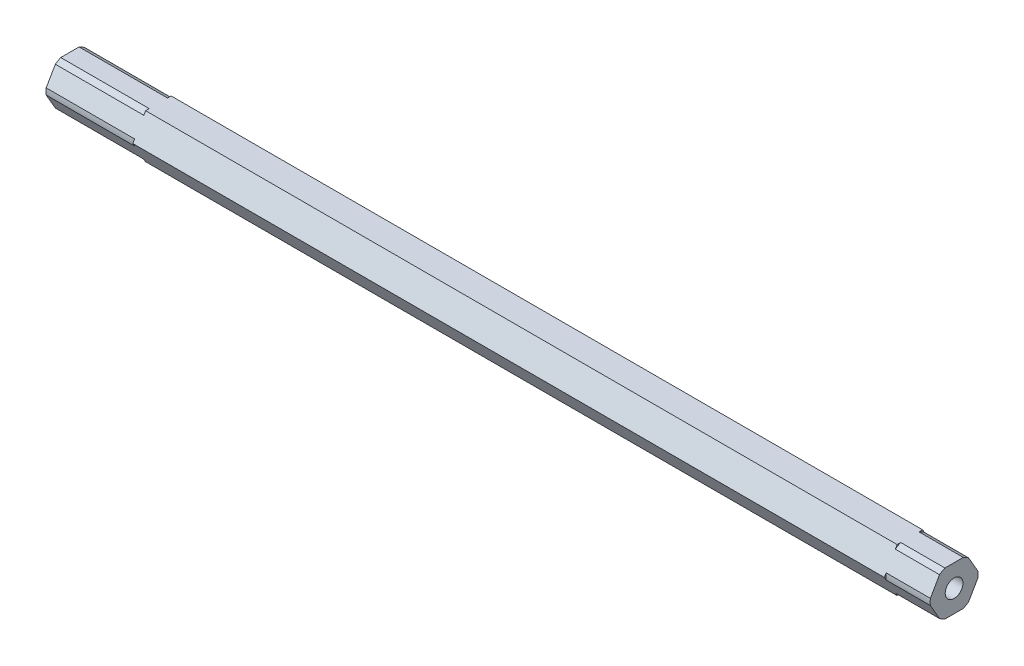
ISO-10303-21;
HEADER;
FILE_DESCRIPTION(('STEP AP214'),'2;1');
FILE_NAME('part.step','',(''),(''),'','','');
FILE_SCHEMA(('AUTOMOTIVE_DESIGN { 1 0 10303 214 1 1 1 1 }'));
ENDSEC;
DATA;
#1=APPLICATION_CONTEXT('core data for automotive mechanical design processes');
#2=APPLICATION_PROTOCOL_DEFINITION('international standard','automotive_design',2000,#1);
#3=PRODUCT_CONTEXT('',#1,'mechanical');
#4=PRODUCT('Part','Part','',(#3));
#5=PRODUCT_RELATED_PRODUCT_CATEGORY('part','',(#4));
#6=PRODUCT_DEFINITION_FORMATION('','',#4);
#7=PRODUCT_DEFINITION_CONTEXT('part definition',#1,'design');
#8=PRODUCT_DEFINITION('design','',#6,#7);
#9=PRODUCT_DEFINITION_SHAPE('','',#8);
#10=(LENGTH_UNIT() NAMED_UNIT(*) SI_UNIT(.MILLI.,.METRE.));
#11=(NAMED_UNIT(*) PLANE_ANGLE_UNIT() SI_UNIT($,.RADIAN.));
#12=(NAMED_UNIT(*) SI_UNIT($,.STERADIAN.) SOLID_ANGLE_UNIT());
#13=UNCERTAINTY_MEASURE_WITH_UNIT(LENGTH_MEASURE(1.E-05),#10,'distance_accuracy_value','');
#14=(GEOMETRIC_REPRESENTATION_CONTEXT(3) GLOBAL_UNCERTAINTY_ASSIGNED_CONTEXT((#13)) GLOBAL_UNIT_ASSIGNED_CONTEXT((#10,
#11,#12)) REPRESENTATION_CONTEXT('',''));
#15=CARTESIAN_POINT('',(0.,0.,0.));
#16=DIRECTION('',(0.,0.,1.));
#17=DIRECTION('',(1.,0.,0.));
#18=AXIS2_PLACEMENT_3D('',#15,#16,#17);
#19=CARTESIAN_POINT('',(127.,-6.35,3.66617420935413));
#20=DIRECTION('',(0.,1.,0.));
#21=DIRECTION('',(0.,0.,1.));
#22=AXIS2_PLACEMENT_3D('',#19,#20,#21);
#23=PLANE('',#22);
#24=DIRECTION('',(0.,0.,-1.));
#25=VECTOR('',#24,1.);
#26=CARTESIAN_POINT('',(114.3,-6.35,3.66617420935413));
#27=LINE('',#26,#25);
#28=CARTESIAN_POINT('',(114.3,-6.35,3.66617420935413));
#29=VERTEX_POINT('',#28);
#30=CARTESIAN_POINT('',(114.3,-6.35,2.6349810245996));
#31=VERTEX_POINT('',#30);
#32=EDGE_CURVE('E272',#29,#31,#27,.T.);
#33=ORIENTED_EDGE('',*,*,#32,.F.);
#34=DIRECTION('',(-1.,0.,0.));
#35=VECTOR('',#34,1.);
#36=CARTESIAN_POINT('',(127.,-6.35,3.66617420935413));
#37=LINE('',#36,#35);
#38=CARTESIAN_POINT('',(-101.6,-6.35,3.66617420935413));
#39=VERTEX_POINT('',#38);
#40=EDGE_CURVE('E353',#29,#39,#37,.T.);
#41=ORIENTED_EDGE('',*,*,#40,.T.);
#42=DIRECTION('',(0.,0.,1.));
#43=VECTOR('',#42,1.);
#44=CARTESIAN_POINT('',(-101.6,-6.35,3.66617420935413));
#45=LINE('',#44,#43);
#46=CARTESIAN_POINT('',(-101.6,-6.35,2.6349810245996));
#47=VERTEX_POINT('',#46);
#48=EDGE_CURVE('E315',#47,#39,#45,.T.);
#49=ORIENTED_EDGE('',*,*,#48,.F.);
#50=DIRECTION('',(-1.,0.,0.));
#51=VECTOR('',#50,1.);
#52=CARTESIAN_POINT('',(-101.6,-6.35,2.6349810245996));
#53=LINE('',#52,#51);
#54=CARTESIAN_POINT('',(-127.,-6.35,2.6349810245996));
#55=VERTEX_POINT('',#54);
#56=EDGE_CURVE('E309',#55,#47,#53,.F.);
#57=ORIENTED_EDGE('',*,*,#56,.F.);
#58=DIRECTION('',(0.,0.,-1.));
#59=VECTOR('',#58,1.);
#60=CARTESIAN_POINT('',(-127.,-6.35,3.66617420935413));
#61=LINE('',#60,#59);
#62=CARTESIAN_POINT('',(-127.,-6.35,-2.63498102459961));
#63=VERTEX_POINT('',#62);
#64=EDGE_CURVE('E332',#55,#63,#61,.T.);
#65=ORIENTED_EDGE('',*,*,#64,.T.);
#66=DIRECTION('',(-1.,0.,0.));
#67=VECTOR('',#66,1.);
#68=CARTESIAN_POINT('',(-101.6,-6.35,-2.63498102459961));
#69=LINE('',#68,#67);
#70=CARTESIAN_POINT('',(-101.6,-6.35,-2.63498102459961));
#71=VERTEX_POINT('',#70);
#72=EDGE_CURVE('E311',#71,#63,#69,.T.);
#73=ORIENTED_EDGE('',*,*,#72,.F.);
#74=CARTESIAN_POINT('',(-101.6,-6.35,-3.66617420935412));
#75=VERTEX_POINT('',#74);
#76=EDGE_CURVE('E319',#75,#71,#45,.T.);
#77=ORIENTED_EDGE('',*,*,#76,.F.);
#78=DIRECTION('',(-1.,0.,0.));
#79=VECTOR('',#78,1.);
#80=CARTESIAN_POINT('',(127.,-6.35,-3.66617420935412));
#81=LINE('',#80,#79);
#82=CARTESIAN_POINT('',(114.3,-6.35,-3.66617420935412));
#83=VERTEX_POINT('',#82);
#84=EDGE_CURVE('E379',#83,#75,#81,.T.);
#85=ORIENTED_EDGE('',*,*,#84,.F.);
#86=CARTESIAN_POINT('',(114.3,-6.35,-2.63498102459961));
#87=VERTEX_POINT('',#86);
#88=EDGE_CURVE('E275',#87,#83,#27,.T.);
#89=ORIENTED_EDGE('',*,*,#88,.F.);
#90=DIRECTION('',(1.,0.,0.));
#91=VECTOR('',#90,1.);
#92=CARTESIAN_POINT('',(114.3,-6.35,-2.63498102459961));
#93=LINE('',#92,#91);
#94=CARTESIAN_POINT('',(127.,-6.35,-2.63498102459961));
#95=VERTEX_POINT('',#94);
#96=EDGE_CURVE('E268',#95,#87,#93,.F.);
#97=ORIENTED_EDGE('',*,*,#96,.F.);
#98=DIRECTION('',(0.,0.,-1.));
#99=VECTOR('',#98,1.);
#100=CARTESIAN_POINT('',(127.,-6.35,3.66617420935413));
#101=LINE('',#100,#99);
#102=CARTESIAN_POINT('',(127.,-6.35,2.6349810245996));
#103=VERTEX_POINT('',#102);
#104=EDGE_CURVE('E336',#103,#95,#101,.T.);
#105=ORIENTED_EDGE('',*,*,#104,.F.);
#106=DIRECTION('',(1.,0.,0.));
#107=VECTOR('',#106,1.);
#108=CARTESIAN_POINT('',(114.3,-6.35,2.6349810245996));
#109=LINE('',#108,#107);
#110=EDGE_CURVE('E270',#31,#103,#109,.T.);
#111=ORIENTED_EDGE('',*,*,#110,.F.);
#112=EDGE_LOOP('',(#33,#41,#49,#57,#65,#73,#77,#85,#89,#97,#105,#111));
#113=FACE_BOUND('',#112,.T.);
#114=ADVANCED_FACE('F37',(#113),#23,.F.);
#115=CARTESIAN_POINT('',(127.,-6.35,-3.66617420935412));
#116=DIRECTION('',(0.,0.5,0.866025403784439));
#117=DIRECTION('',(0.,-0.866025403784439,0.5));
#118=AXIS2_PLACEMENT_3D('',#115,#116,#117);
#119=PLANE('',#118);
#120=DIRECTION('',(0.,0.866025403784439,-0.5));
#121=VECTOR('',#120,1.);
#122=CARTESIAN_POINT('',(114.3,-6.35,-3.66617420935412));
#123=LINE('',#122,#121);
#124=CARTESIAN_POINT('',(114.3,-5.45696050579321,-4.18177080173138));
#125=VERTEX_POINT('',#124);
#126=EDGE_CURVE('E282',#83,#125,#123,.T.);
#127=ORIENTED_EDGE('',*,*,#126,.F.);
#128=ORIENTED_EDGE('',*,*,#84,.T.);
#129=DIRECTION('',(0.,-0.866025403784439,0.5));
#130=VECTOR('',#129,1.);
#131=CARTESIAN_POINT('',(-101.6,-6.35,-3.66617420935412));
#132=LINE('',#131,#130);
#133=CARTESIAN_POINT('',(-101.6,-5.45696050579321,-4.18177080173138));
#134=VERTEX_POINT('',#133);
#135=EDGE_CURVE('E328',#134,#75,#132,.T.);
#136=ORIENTED_EDGE('',*,*,#135,.F.);
#137=DIRECTION('',(-1.,0.,0.));
#138=VECTOR('',#137,1.);
#139=CARTESIAN_POINT('',(-101.6,-5.45696050579321,-4.18177080173138));
#140=LINE('',#139,#138);
#141=CARTESIAN_POINT('',(-127.,-5.45696050579321,-4.18177080173138));
#142=VERTEX_POINT('',#141);
#143=EDGE_CURVE('E305',#142,#134,#140,.F.);
#144=ORIENTED_EDGE('',*,*,#143,.F.);
#145=DIRECTION('',(0.,0.866025403784439,-0.5));
#146=VECTOR('',#145,1.);
#147=CARTESIAN_POINT('',(-127.,-6.35,-3.66617420935412));
#148=LINE('',#147,#146);
#149=CARTESIAN_POINT('',(-127.,-0.893039494206791,-6.81675182633099));
#150=VERTEX_POINT('',#149);
#151=EDGE_CURVE('E356',#142,#150,#148,.T.);
#152=ORIENTED_EDGE('',*,*,#151,.T.);
#153=DIRECTION('',(-1.,0.,0.));
#154=VECTOR('',#153,1.);
#155=CARTESIAN_POINT('',(-101.6,-0.893039494206791,-6.81675182633099));
#156=LINE('',#155,#154);
#157=CARTESIAN_POINT('',(-101.6,-0.893039494206791,-6.81675182633099));
#158=VERTEX_POINT('',#157);
#159=EDGE_CURVE('E307',#158,#150,#156,.T.);
#160=ORIENTED_EDGE('',*,*,#159,.F.);
#161=CARTESIAN_POINT('',(-101.6,0.,-7.33234841870825));
#162=VERTEX_POINT('',#161);
#163=EDGE_CURVE('E326',#162,#158,#132,.T.);
#164=ORIENTED_EDGE('',*,*,#163,.F.);
#165=DIRECTION('',(-1.,0.,0.));
#166=VECTOR('',#165,1.);
#167=CARTESIAN_POINT('',(127.,0.,-7.33234841870825));
#168=LINE('',#167,#166);
#169=CARTESIAN_POINT('',(114.3,0.,-7.33234841870825));
#170=VERTEX_POINT('',#169);
#171=EDGE_CURVE('E377',#170,#162,#168,.T.);
#172=ORIENTED_EDGE('',*,*,#171,.F.);
#173=CARTESIAN_POINT('',(114.3,-0.893039494206791,-6.81675182633099));
#174=VERTEX_POINT('',#173);
#175=EDGE_CURVE('E239',#174,#170,#123,.T.);
#176=ORIENTED_EDGE('',*,*,#175,.F.);
#177=DIRECTION('',(1.,0.,0.));
#178=VECTOR('',#177,1.);
#179=CARTESIAN_POINT('',(114.3,-0.893039494206791,-6.81675182633099));
#180=LINE('',#179,#178);
#181=CARTESIAN_POINT('',(127.,-0.893039494206795,-6.81675182633099));
#182=VERTEX_POINT('',#181);
#183=EDGE_CURVE('E250',#182,#174,#180,.F.);
#184=ORIENTED_EDGE('',*,*,#183,.F.);
#185=DIRECTION('',(0.,0.866025403784439,-0.5));
#186=VECTOR('',#185,1.);
#187=CARTESIAN_POINT('',(127.,-6.35,-3.66617420935412));
#188=LINE('',#187,#186);
#189=CARTESIAN_POINT('',(127.,-5.45696050579321,-4.18177080173138));
#190=VERTEX_POINT('',#189);
#191=EDGE_CURVE('E339',#190,#182,#188,.T.);
#192=ORIENTED_EDGE('',*,*,#191,.F.);
#193=DIRECTION('',(1.,0.,0.));
#194=VECTOR('',#193,1.);
#195=CARTESIAN_POINT('',(114.3,-5.45696050579321,-4.18177080173138));
#196=LINE('',#195,#194);
#197=EDGE_CURVE('E261',#125,#190,#196,.T.);
#198=ORIENTED_EDGE('',*,*,#197,.F.);
#199=EDGE_LOOP('',(#127,#128,#136,#144,#152,#160,#164,#172,#176,#184,#192,#198));
#200=FACE_BOUND('',#199,.T.);
#201=ADVANCED_FACE('F537',(#200),#119,.F.);
#202=CARTESIAN_POINT('',(127.,0.,-7.33234841870825));
#203=DIRECTION('',(0.,-0.5,0.866025403784439));
#204=DIRECTION('',(0.,-0.866025403784439,-0.5));
#205=AXIS2_PLACEMENT_3D('',#202,#203,#204);
#206=PLANE('',#205);
#207=DIRECTION('',(0.,0.866025403784439,0.5));
#208=VECTOR('',#207,1.);
#209=CARTESIAN_POINT('',(114.3,0.,-7.33234841870825));
#210=LINE('',#209,#208);
#211=CARTESIAN_POINT('',(114.3,0.89303949420679,-6.81675182633099));
#212=VERTEX_POINT('',#211);
#213=EDGE_CURVE('E234',#170,#212,#210,.T.);
#214=ORIENTED_EDGE('',*,*,#213,.F.);
#215=ORIENTED_EDGE('',*,*,#171,.T.);
#216=DIRECTION('',(0.,-0.866025403784439,-0.5));
#217=VECTOR('',#216,1.);
#218=CARTESIAN_POINT('',(-101.6,0.,-7.33234841870825));
#219=LINE('',#218,#217);
#220=CARTESIAN_POINT('',(-101.6,0.89303949420679,-6.81675182633099));
#221=VERTEX_POINT('',#220);
#222=EDGE_CURVE('E325',#221,#162,#219,.T.);
#223=ORIENTED_EDGE('',*,*,#222,.F.);
#224=DIRECTION('',(-1.,0.,0.));
#225=VECTOR('',#224,1.);
#226=CARTESIAN_POINT('',(-101.6,0.89303949420679,-6.81675182633099));
#227=LINE('',#226,#225);
#228=CARTESIAN_POINT('',(-127.,0.893039494206791,-6.81675182633099));
#229=VERTEX_POINT('',#228);
#230=EDGE_CURVE('E301',#229,#221,#227,.F.);
#231=ORIENTED_EDGE('',*,*,#230,.F.);
#232=DIRECTION('',(0.,0.866025403784439,0.5));
#233=VECTOR('',#232,1.);
#234=CARTESIAN_POINT('',(-127.,0.,-7.33234841870825));
#235=LINE('',#234,#233);
#236=CARTESIAN_POINT('',(-127.,5.45696050579321,-4.18177080173138));
#237=VERTEX_POINT('',#236);
#238=EDGE_CURVE('E359',#229,#237,#235,.T.);
#239=ORIENTED_EDGE('',*,*,#238,.T.);
#240=DIRECTION('',(-1.,0.,0.));
#241=VECTOR('',#240,1.);
#242=CARTESIAN_POINT('',(-101.6,5.45696050579321,-4.18177080173138));
#243=LINE('',#242,#241);
#244=CARTESIAN_POINT('',(-101.6,5.45696050579321,-4.18177080173138));
#245=VERTEX_POINT('',#244);
#246=EDGE_CURVE('E303',#245,#237,#243,.T.);
#247=ORIENTED_EDGE('',*,*,#246,.F.);
#248=CARTESIAN_POINT('',(-101.6,6.35,-3.66617420935413));
#249=VERTEX_POINT('',#248);
#250=EDGE_CURVE('E323',#249,#245,#219,.T.);
#251=ORIENTED_EDGE('',*,*,#250,.F.);
#252=DIRECTION('',(-1.,0.,0.));
#253=VECTOR('',#252,1.);
#254=CARTESIAN_POINT('',(127.,6.35,-3.66617420935413));
#255=LINE('',#254,#253);
#256=CARTESIAN_POINT('',(114.3,6.35,-3.66617420935413));
#257=VERTEX_POINT('',#256);
#258=EDGE_CURVE('E375',#257,#249,#255,.T.);
#259=ORIENTED_EDGE('',*,*,#258,.F.);
#260=CARTESIAN_POINT('',(114.3,5.45696050579321,-4.18177080173138));
#261=VERTEX_POINT('',#260);
#262=EDGE_CURVE('E243',#261,#257,#210,.T.);
#263=ORIENTED_EDGE('',*,*,#262,.F.);
#264=DIRECTION('',(1.,0.,0.));
#265=VECTOR('',#264,1.);
#266=CARTESIAN_POINT('',(114.3,5.45696050579321,-4.18177080173138));
#267=LINE('',#266,#265);
#268=CARTESIAN_POINT('',(127.,5.4569605057932,-4.18177080173139));
#269=VERTEX_POINT('',#268);
#270=EDGE_CURVE('E259',#269,#261,#267,.F.);
#271=ORIENTED_EDGE('',*,*,#270,.F.);
#272=DIRECTION('',(0.,0.866025403784439,0.5));
#273=VECTOR('',#272,1.);
#274=CARTESIAN_POINT('',(127.,0.,-7.33234841870825));
#275=LINE('',#274,#273);
#276=CARTESIAN_POINT('',(127.,0.893039494206796,-6.81675182633099));
#277=VERTEX_POINT('',#276);
#278=EDGE_CURVE('E258',#277,#269,#275,.T.);
#279=ORIENTED_EDGE('',*,*,#278,.F.);
#280=DIRECTION('',(1.,0.,0.));
#281=VECTOR('',#280,1.);
#282=CARTESIAN_POINT('',(114.3,0.89303949420679,-6.81675182633099));
#283=LINE('',#282,#281);
#284=EDGE_CURVE('E247',#212,#277,#283,.T.);
#285=ORIENTED_EDGE('',*,*,#284,.F.);
#286=EDGE_LOOP('',(#214,#215,#223,#231,#239,#247,#251,#259,#263,#271,#279,#285));
#287=FACE_BOUND('',#286,.T.);
#288=ADVANCED_FACE('F255',(#287),#206,.F.);
#289=CARTESIAN_POINT('',(127.,6.35,-3.66617420935413));
#290=DIRECTION('',(0.,-1.,0.));
#291=DIRECTION('',(0.,0.,-1.));
#292=AXIS2_PLACEMENT_3D('',#289,#290,#291);
#293=PLANE('',#292);
#294=DIRECTION('',(0.,0.,1.));
#295=VECTOR('',#294,1.);
#296=CARTESIAN_POINT('',(114.3,6.35,-3.66617420935413));
#297=LINE('',#296,#295);
#298=CARTESIAN_POINT('',(114.3,6.35,-2.6349810245996));
#299=VERTEX_POINT('',#298);
#300=EDGE_CURVE('E279',#257,#299,#297,.T.);
#301=ORIENTED_EDGE('',*,*,#300,.F.);
#302=ORIENTED_EDGE('',*,*,#258,.T.);
#303=DIRECTION('',(0.,0.,-1.));
#304=VECTOR('',#303,1.);
#305=CARTESIAN_POINT('',(-101.6,6.35,-3.66617420935413));
#306=LINE('',#305,#304);
#307=CARTESIAN_POINT('',(-101.6,6.35,-2.6349810245996));
#308=VERTEX_POINT('',#307);
#309=EDGE_CURVE('E322',#308,#249,#306,.T.);
#310=ORIENTED_EDGE('',*,*,#309,.F.);
#311=DIRECTION('',(-1.,0.,0.));
#312=VECTOR('',#311,1.);
#313=CARTESIAN_POINT('',(-101.6,6.35,-2.6349810245996));
#314=LINE('',#313,#312);
#315=CARTESIAN_POINT('',(-127.,6.35,-2.6349810245996));
#316=VERTEX_POINT('',#315);
#317=EDGE_CURVE('E297',#316,#308,#314,.F.);
#318=ORIENTED_EDGE('',*,*,#317,.F.);
#319=DIRECTION('',(0.,0.,1.));
#320=VECTOR('',#319,1.);
#321=CARTESIAN_POINT('',(-127.,6.35,-3.66617420935413));
#322=LINE('',#321,#320);
#323=CARTESIAN_POINT('',(-127.,6.35,2.6349810245996));
#324=VERTEX_POINT('',#323);
#325=EDGE_CURVE('E362',#316,#324,#322,.T.);
#326=ORIENTED_EDGE('',*,*,#325,.T.);
#327=DIRECTION('',(-1.,0.,0.));
#328=VECTOR('',#327,1.);
#329=CARTESIAN_POINT('',(-101.6,6.35,2.6349810245996));
#330=LINE('',#329,#328);
#331=CARTESIAN_POINT('',(-101.6,6.35,2.6349810245996));
#332=VERTEX_POINT('',#331);
#333=EDGE_CURVE('E299',#332,#324,#330,.T.);
#334=ORIENTED_EDGE('',*,*,#333,.F.);
#335=CARTESIAN_POINT('',(-101.6,6.35,3.66617420935412));
#336=VERTEX_POINT('',#335);
#337=EDGE_CURVE('E320',#336,#332,#306,.T.);
#338=ORIENTED_EDGE('',*,*,#337,.F.);
#339=DIRECTION('',(-1.,0.,0.));
#340=VECTOR('',#339,1.);
#341=CARTESIAN_POINT('',(127.,6.35,3.66617420935412));
#342=LINE('',#341,#340);
#343=CARTESIAN_POINT('',(114.3,6.35,3.66617420935412));
#344=VERTEX_POINT('',#343);
#345=EDGE_CURVE('E373',#344,#336,#342,.T.);
#346=ORIENTED_EDGE('',*,*,#345,.F.);
#347=CARTESIAN_POINT('',(114.3,6.35,2.6349810245996));
#348=VERTEX_POINT('',#347);
#349=EDGE_CURVE('E278',#348,#344,#297,.T.);
#350=ORIENTED_EDGE('',*,*,#349,.F.);
#351=DIRECTION('',(1.,0.,0.));
#352=VECTOR('',#351,1.);
#353=CARTESIAN_POINT('',(114.3,6.35,2.6349810245996));
#354=LINE('',#353,#352);
#355=CARTESIAN_POINT('',(127.,6.35,2.6349810245996));
#356=VERTEX_POINT('',#355);
#357=EDGE_CURVE('E430',#356,#348,#354,.F.);
#358=ORIENTED_EDGE('',*,*,#357,.F.);
#359=DIRECTION('',(0.,0.,1.));
#360=VECTOR('',#359,1.);
#361=CARTESIAN_POINT('',(127.,6.35,-3.66617420935413));
#362=LINE('',#361,#360);
#363=CARTESIAN_POINT('',(127.,6.35,-2.6349810245996));
#364=VERTEX_POINT('',#363);
#365=EDGE_CURVE('E344',#364,#356,#362,.T.);
#366=ORIENTED_EDGE('',*,*,#365,.F.);
#367=DIRECTION('',(1.,0.,0.));
#368=VECTOR('',#367,1.);
#369=CARTESIAN_POINT('',(114.3,6.35,-2.6349810245996));
#370=LINE('',#369,#368);
#371=EDGE_CURVE('E263',#299,#364,#370,.T.);
#372=ORIENTED_EDGE('',*,*,#371,.F.);
#373=EDGE_LOOP('',(#301,#302,#310,#318,#326,#334,#338,#346,#350,#358,#366,#372));
#374=FACE_BOUND('',#373,.T.);
#375=ADVANCED_FACE('F438',(#374),#293,.F.);
#376=CARTESIAN_POINT('',(127.,6.35,3.66617420935412));
#377=DIRECTION('',(0.,-0.5,-0.866025403784438));
#378=DIRECTION('',(0.,0.866025403784439,-0.5));
#379=AXIS2_PLACEMENT_3D('',#376,#377,#378);
#380=PLANE('',#379);
#381=DIRECTION('',(0.,-0.866025403784439,0.5));
#382=VECTOR('',#381,1.);
#383=CARTESIAN_POINT('',(114.3,6.35,3.66617420935412));
#384=LINE('',#383,#382);
#385=CARTESIAN_POINT('',(114.3,5.45696050579321,4.18177080173138));
#386=VERTEX_POINT('',#385);
#387=EDGE_CURVE('E277',#344,#386,#384,.T.);
#388=ORIENTED_EDGE('',*,*,#387,.F.);
#389=ORIENTED_EDGE('',*,*,#345,.T.);
#390=DIRECTION('',(0.,0.866025403784439,-0.5));
#391=VECTOR('',#390,1.);
#392=CARTESIAN_POINT('',(-101.6,6.35,3.66617420935412));
#393=LINE('',#392,#391);
#394=CARTESIAN_POINT('',(-101.6,5.45696050579321,4.18177080173138));
#395=VERTEX_POINT('',#394);
#396=EDGE_CURVE('E316',#395,#336,#393,.T.);
#397=ORIENTED_EDGE('',*,*,#396,.F.);
#398=DIRECTION('',(-1.,0.,0.));
#399=VECTOR('',#398,1.);
#400=CARTESIAN_POINT('',(-101.6,5.45696050579321,4.18177080173138));
#401=LINE('',#400,#399);
#402=CARTESIAN_POINT('',(-127.,5.45696050579321,4.18177080173138));
#403=VERTEX_POINT('',#402);
#404=EDGE_CURVE('E293',#403,#395,#401,.F.);
#405=ORIENTED_EDGE('',*,*,#404,.F.);
#406=DIRECTION('',(0.,-0.866025403784439,0.5));
#407=VECTOR('',#406,1.);
#408=CARTESIAN_POINT('',(-127.,6.35,3.66617420935412));
#409=LINE('',#408,#407);
#410=CARTESIAN_POINT('',(-127.,0.893039494206793,6.81675182633099));
#411=VERTEX_POINT('',#410);
#412=EDGE_CURVE('E365',#403,#411,#409,.T.);
#413=ORIENTED_EDGE('',*,*,#412,.T.);
#414=DIRECTION('',(-1.,0.,0.));
#415=VECTOR('',#414,1.);
#416=CARTESIAN_POINT('',(-101.6,0.893039494206793,6.81675182633099));
#417=LINE('',#416,#415);
#418=CARTESIAN_POINT('',(-101.6,0.893039494206793,6.81675182633099));
#419=VERTEX_POINT('',#418);
#420=EDGE_CURVE('E295',#419,#411,#417,.T.);
#421=ORIENTED_EDGE('',*,*,#420,.F.);
#422=CARTESIAN_POINT('',(-101.6,0.,7.33234841870825));
#423=VERTEX_POINT('',#422);
#424=EDGE_CURVE('E313',#423,#419,#393,.T.);
#425=ORIENTED_EDGE('',*,*,#424,.F.);
#426=DIRECTION('',(-1.,0.,0.));
#427=VECTOR('',#426,1.);
#428=CARTESIAN_POINT('',(127.,0.,7.33234841870825));
#429=LINE('',#428,#427);
#430=CARTESIAN_POINT('',(114.3,0.,7.33234841870825));
#431=VERTEX_POINT('',#430);
#432=EDGE_CURVE('E371',#431,#423,#429,.T.);
#433=ORIENTED_EDGE('',*,*,#432,.F.);
#434=CARTESIAN_POINT('',(114.3,0.893039494206793,6.81675182633099));
#435=VERTEX_POINT('',#434);
#436=EDGE_CURVE('E274',#435,#431,#384,.T.);
#437=ORIENTED_EDGE('',*,*,#436,.F.);
#438=DIRECTION('',(1.,0.,0.));
#439=VECTOR('',#438,1.);
#440=CARTESIAN_POINT('',(114.3,0.893039494206793,6.81675182633099));
#441=LINE('',#440,#439);
#442=CARTESIAN_POINT('',(127.,0.893039494206796,6.81675182633099));
#443=VERTEX_POINT('',#442);
#444=EDGE_CURVE('E427',#443,#435,#441,.F.);
#445=ORIENTED_EDGE('',*,*,#444,.F.);
#446=DIRECTION('',(0.,-0.866025403784439,0.5));
#447=VECTOR('',#446,1.);
#448=CARTESIAN_POINT('',(127.,6.35,3.66617420935412));
#449=LINE('',#448,#447);
#450=CARTESIAN_POINT('',(127.,5.45696050579321,4.18177080173138));
#451=VERTEX_POINT('',#450);
#452=EDGE_CURVE('E347',#451,#443,#449,.T.);
#453=ORIENTED_EDGE('',*,*,#452,.F.);
#454=DIRECTION('',(1.,0.,0.));
#455=VECTOR('',#454,1.);
#456=CARTESIAN_POINT('',(114.3,5.45696050579321,4.18177080173138));
#457=LINE('',#456,#455);
#458=EDGE_CURVE('E59',#386,#451,#457,.T.);
#459=ORIENTED_EDGE('',*,*,#458,.F.);
#460=EDGE_LOOP('',(#388,#389,#397,#405,#413,#421,#425,#433,#437,#445,#453,#459));
#461=FACE_BOUND('',#460,.T.);
#462=ADVANCED_FACE('F549',(#461),#380,.F.);
#463=CARTESIAN_POINT('',(127.,0.,7.33234841870825));
#464=DIRECTION('',(0.,0.5,-0.866025403784439));
#465=DIRECTION('',(0.,0.866025403784439,0.5));
#466=AXIS2_PLACEMENT_3D('',#463,#464,#465);
#467=PLANE('',#466);
#468=DIRECTION('',(0.,-0.866025403784439,-0.5));
#469=VECTOR('',#468,1.);
#470=CARTESIAN_POINT('',(114.3,0.,7.33234841870825));
#471=LINE('',#470,#469);
#472=CARTESIAN_POINT('',(114.3,-0.893039494206794,6.81675182633099));
#473=VERTEX_POINT('',#472);
#474=EDGE_CURVE('E12',#431,#473,#471,.T.);
#475=ORIENTED_EDGE('',*,*,#474,.F.);
#476=ORIENTED_EDGE('',*,*,#432,.T.);
#477=DIRECTION('',(0.,0.866025403784439,0.5));
#478=VECTOR('',#477,1.);
#479=CARTESIAN_POINT('',(-101.6,0.,7.33234841870825));
#480=LINE('',#479,#478);
#481=CARTESIAN_POINT('',(-101.6,-0.893039494206794,6.81675182633099));
#482=VERTEX_POINT('',#481);
#483=EDGE_CURVE('E383',#482,#423,#480,.T.);
#484=ORIENTED_EDGE('',*,*,#483,.F.);
#485=DIRECTION('',(-1.,0.,0.));
#486=VECTOR('',#485,1.);
#487=CARTESIAN_POINT('',(-101.6,-0.893039494206794,6.81675182633099));
#488=LINE('',#487,#486);
#489=CARTESIAN_POINT('',(-127.,-0.893039494206794,6.81675182633099));
#490=VERTEX_POINT('',#489);
#491=EDGE_CURVE('E381',#490,#482,#488,.F.);
#492=ORIENTED_EDGE('',*,*,#491,.F.);
#493=DIRECTION('',(0.,-0.866025403784439,-0.5));
#494=VECTOR('',#493,1.);
#495=CARTESIAN_POINT('',(-127.,0.,7.33234841870825));
#496=LINE('',#495,#494);
#497=CARTESIAN_POINT('',(-127.,-5.4569605057932,4.18177080173139));
#498=VERTEX_POINT('',#497);
#499=EDGE_CURVE('E340',#490,#498,#496,.T.);
#500=ORIENTED_EDGE('',*,*,#499,.T.);
#501=DIRECTION('',(-1.,0.,0.));
#502=VECTOR('',#501,1.);
#503=CARTESIAN_POINT('',(-101.6,-5.4569605057932,4.18177080173139));
#504=LINE('',#503,#502);
#505=CARTESIAN_POINT('',(-101.6,-5.4569605057932,4.18177080173139));
#506=VERTEX_POINT('',#505);
#507=EDGE_CURVE('E386',#506,#498,#504,.T.);
#508=ORIENTED_EDGE('',*,*,#507,.F.);
#509=EDGE_CURVE('E387',#39,#506,#480,.T.);
#510=ORIENTED_EDGE('',*,*,#509,.F.);
#511=ORIENTED_EDGE('',*,*,#40,.F.);
#512=CARTESIAN_POINT('',(114.3,-5.4569605057932,4.18177080173139));
#513=VERTEX_POINT('',#512);
#514=EDGE_CURVE('E40',#513,#29,#471,.T.);
#515=ORIENTED_EDGE('',*,*,#514,.F.);
#516=DIRECTION('',(1.,0.,0.));
#517=VECTOR('',#516,1.);
#518=CARTESIAN_POINT('',(114.3,-5.4569605057932,4.18177080173139));
#519=LINE('',#518,#517);
#520=CARTESIAN_POINT('',(127.,-5.45696050579321,4.18177080173139));
#521=VERTEX_POINT('',#520);
#522=EDGE_CURVE('E424',#521,#513,#519,.F.);
#523=ORIENTED_EDGE('',*,*,#522,.F.);
#524=DIRECTION('',(0.,-0.866025403784439,-0.5));
#525=VECTOR('',#524,1.);
#526=CARTESIAN_POINT('',(127.,0.,7.33234841870825));
#527=LINE('',#526,#525);
#528=CARTESIAN_POINT('',(127.,-0.893039494206792,6.81675182633099));
#529=VERTEX_POINT('',#528);
#530=EDGE_CURVE('E350',#529,#521,#527,.T.);
#531=ORIENTED_EDGE('',*,*,#530,.F.);
#532=DIRECTION('',(1.,0.,0.));
#533=VECTOR('',#532,1.);
#534=CARTESIAN_POINT('',(114.3,-0.893039494206794,6.81675182633099));
#535=LINE('',#534,#533);
#536=EDGE_CURVE('E51',#473,#529,#535,.T.);
#537=ORIENTED_EDGE('',*,*,#536,.F.);
#538=EDGE_LOOP('',(#475,#476,#484,#492,#500,#508,#510,#511,#515,#523,#531,#537));
#539=FACE_BOUND('',#538,.T.);
#540=ADVANCED_FACE('F456',(#539),#467,.F.);
#541=CARTESIAN_POINT('',(127.,0.,0.));
#542=DIRECTION('',(1.,0.,0.));
#543=DIRECTION('',(0.,0.,-1.));
#544=AXIS2_PLACEMENT_3D('',#541,#542,#543);
#545=PLANE('',#544);
#546=CARTESIAN_POINT('',(127.,0.,0.));
#547=DIRECTION('',(1.,0.,0.));
#548=DIRECTION('',(0.,0.,-1.));
#549=AXIS2_PLACEMENT_3D('',#546,#547,#548);
#550=CIRCLE('',#549,2.5527);
#551=CARTESIAN_POINT('',(127.,0.,-2.5527));
#552=VERTEX_POINT('',#551);
#553=EDGE_CURVE('E329',#552,#552,#550,.T.);
#554=ORIENTED_EDGE('',*,*,#553,.F.);
#555=EDGE_LOOP('',(#554));
#556=FACE_BOUND('',#555,.T.);
#557=ORIENTED_EDGE('',*,*,#278,.T.);
#558=CARTESIAN_POINT('',(127.,0.,0.));
#559=DIRECTION('',(1.,0.,0.));
#560=DIRECTION('',(0.,0.,-1.));
#561=AXIS2_PLACEMENT_3D('',#558,#559,#560);
#562=CIRCLE('',#561,6.875);
#563=EDGE_CURVE('E390',#269,#364,#562,.T.);
#564=ORIENTED_EDGE('',*,*,#563,.T.);
#565=ORIENTED_EDGE('',*,*,#365,.T.);
#566=EDGE_CURVE('E396',#356,#451,#562,.T.);
#567=ORIENTED_EDGE('',*,*,#566,.T.);
#568=ORIENTED_EDGE('',*,*,#452,.T.);
#569=EDGE_CURVE('E398',#443,#529,#562,.T.);
#570=ORIENTED_EDGE('',*,*,#569,.T.);
#571=ORIENTED_EDGE('',*,*,#530,.T.);
#572=EDGE_CURVE('E393',#521,#103,#562,.T.);
#573=ORIENTED_EDGE('',*,*,#572,.T.);
#574=ORIENTED_EDGE('',*,*,#104,.T.);
#575=EDGE_CURVE('E389',#95,#190,#562,.T.);
#576=ORIENTED_EDGE('',*,*,#575,.T.);
#577=ORIENTED_EDGE('',*,*,#191,.T.);
#578=EDGE_CURVE('E388',#182,#277,#562,.T.);
#579=ORIENTED_EDGE('',*,*,#578,.T.);
#580=EDGE_LOOP('',(#557,#564,#565,#567,#568,#570,#571,#573,#574,#576,#577,#579));
#581=FACE_BOUND('',#580,.T.);
#582=ADVANCED_FACE('F403',(#556,#581),#545,.T.);
#583=CARTESIAN_POINT('',(-127.,0.,0.));
#584=DIRECTION('',(1.,0.,0.));
#585=DIRECTION('',(0.,0.,-1.));
#586=AXIS2_PLACEMENT_3D('',#583,#584,#585);
#587=PLANE('',#586);
#588=CARTESIAN_POINT('',(-127.,0.,0.));
#589=DIRECTION('',(1.,0.,0.));
#590=DIRECTION('',(0.,0.,-1.));
#591=AXIS2_PLACEMENT_3D('',#588,#589,#590);
#592=CIRCLE('',#591,2.5527);
#593=CARTESIAN_POINT('',(-127.,0.,-2.5527));
#594=VERTEX_POINT('',#593);
#595=EDGE_CURVE('E333',#594,#594,#592,.T.);
#596=ORIENTED_EDGE('',*,*,#595,.T.);
#597=EDGE_LOOP('',(#596));
#598=FACE_BOUND('',#597,.T.);
#599=CARTESIAN_POINT('',(-127.,0.,0.));
#600=DIRECTION('',(-1.,0.,0.));
#601=DIRECTION('',(0.,0.,1.));
#602=AXIS2_PLACEMENT_3D('',#599,#600,#601);
#603=CIRCLE('',#602,6.875);
#604=EDGE_CURVE('E486',#316,#237,#603,.T.);
#605=ORIENTED_EDGE('',*,*,#604,.T.);
#606=ORIENTED_EDGE('',*,*,#238,.F.);
#607=EDGE_CURVE('E485',#229,#150,#603,.T.);
#608=ORIENTED_EDGE('',*,*,#607,.T.);
#609=ORIENTED_EDGE('',*,*,#151,.F.);
#610=EDGE_CURVE('E481',#142,#63,#603,.T.);
#611=ORIENTED_EDGE('',*,*,#610,.T.);
#612=ORIENTED_EDGE('',*,*,#64,.F.);
#613=EDGE_CURVE('E292',#55,#498,#603,.T.);
#614=ORIENTED_EDGE('',*,*,#613,.T.);
#615=ORIENTED_EDGE('',*,*,#499,.F.);
#616=EDGE_CURVE('E289',#490,#411,#603,.T.);
#617=ORIENTED_EDGE('',*,*,#616,.T.);
#618=ORIENTED_EDGE('',*,*,#412,.F.);
#619=EDGE_CURVE('E287',#403,#324,#603,.T.);
#620=ORIENTED_EDGE('',*,*,#619,.T.);
#621=ORIENTED_EDGE('',*,*,#325,.F.);
#622=EDGE_LOOP('',(#605,#606,#608,#609,#611,#612,#614,#615,#617,#618,#620,#621));
#623=FACE_BOUND('',#622,.T.);
#624=ADVANCED_FACE('F478',(#598,#623),#587,.F.);
#625=CARTESIAN_POINT('',(127.,0.,0.));
#626=DIRECTION('',(-1.,0.,0.));
#627=DIRECTION('',(0.,0.,1.));
#628=AXIS2_PLACEMENT_3D('',#625,#626,#627);
#629=CYLINDRICAL_SURFACE('',#628,2.5527);
#630=ORIENTED_EDGE('',*,*,#553,.T.);
#631=EDGE_LOOP('',(#630));
#632=FACE_BOUND('',#631,.T.);
#633=ORIENTED_EDGE('',*,*,#595,.F.);
#634=EDGE_LOOP('',(#633));
#635=FACE_BOUND('',#634,.T.);
#636=ADVANCED_FACE('F557',(#632,#635),#629,.F.);
#637=CARTESIAN_POINT('',(-101.6,0.,0.));
#638=DIRECTION('',(-1.,0.,0.));
#639=DIRECTION('',(0.,0.,1.));
#640=AXIS2_PLACEMENT_3D('',#637,#638,#639);
#641=CYLINDRICAL_SURFACE('',#640,6.875);
#642=ORIENTED_EDGE('',*,*,#420,.T.);
#643=ORIENTED_EDGE('',*,*,#616,.F.);
#644=ORIENTED_EDGE('',*,*,#491,.T.);
#645=CARTESIAN_POINT('',(-101.6,0.,0.));
#646=DIRECTION('',(-1.,0.,0.));
#647=DIRECTION('',(0.,0.,1.));
#648=AXIS2_PLACEMENT_3D('',#645,#646,#647);
#649=CIRCLE('',#648,6.875);
#650=EDGE_CURVE('E283',#482,#419,#649,.T.);
#651=ORIENTED_EDGE('',*,*,#650,.T.);
#652=EDGE_LOOP('',(#642,#643,#644,#651));
#653=FACE_BOUND('',#652,.T.);
#654=ADVANCED_FACE('F529',(#653),#641,.T.);
#655=CARTESIAN_POINT('',(-101.6,0.,0.));
#656=DIRECTION('',(-1.,0.,0.));
#657=DIRECTION('',(0.,0.,1.));
#658=AXIS2_PLACEMENT_3D('',#655,#656,#657);
#659=PLANE('',#658);
#660=ORIENTED_EDGE('',*,*,#424,.T.);
#661=ORIENTED_EDGE('',*,*,#650,.F.);
#662=ORIENTED_EDGE('',*,*,#483,.T.);
#663=EDGE_LOOP('',(#660,#661,#662));
#664=FACE_BOUND('',#663,.T.);
#665=ADVANCED_FACE('F518',(#664),#659,.T.);
#666=ORIENTED_EDGE('',*,*,#56,.T.);
#667=EDGE_CURVE('E286',#47,#506,#649,.T.);
#668=ORIENTED_EDGE('',*,*,#667,.T.);
#669=ORIENTED_EDGE('',*,*,#507,.T.);
#670=ORIENTED_EDGE('',*,*,#613,.F.);
#671=EDGE_LOOP('',(#666,#668,#669,#670));
#672=FACE_BOUND('',#671,.T.);
#673=ADVANCED_FACE('F516',(#672),#641,.T.);
#674=ORIENTED_EDGE('',*,*,#48,.T.);
#675=ORIENTED_EDGE('',*,*,#509,.T.);
#676=ORIENTED_EDGE('',*,*,#667,.F.);
#677=EDGE_LOOP('',(#674,#675,#676));
#678=FACE_BOUND('',#677,.T.);
#679=ADVANCED_FACE('F469',(#678),#659,.T.);
#680=ORIENTED_EDGE('',*,*,#333,.T.);
#681=ORIENTED_EDGE('',*,*,#619,.F.);
#682=ORIENTED_EDGE('',*,*,#404,.T.);
#683=EDGE_CURVE('E288',#395,#332,#649,.T.);
#684=ORIENTED_EDGE('',*,*,#683,.T.);
#685=EDGE_LOOP('',(#680,#681,#682,#684));
#686=FACE_BOUND('',#685,.T.);
#687=ADVANCED_FACE('F526',(#686),#641,.T.);
#688=ORIENTED_EDGE('',*,*,#337,.T.);
#689=ORIENTED_EDGE('',*,*,#683,.F.);
#690=ORIENTED_EDGE('',*,*,#396,.T.);
#691=EDGE_LOOP('',(#688,#689,#690));
#692=FACE_BOUND('',#691,.T.);
#693=ADVANCED_FACE('F528',(#692),#659,.T.);
#694=ORIENTED_EDGE('',*,*,#246,.T.);
#695=ORIENTED_EDGE('',*,*,#604,.F.);
#696=ORIENTED_EDGE('',*,*,#317,.T.);
#697=EDGE_CURVE('E502',#308,#245,#649,.T.);
#698=ORIENTED_EDGE('',*,*,#697,.T.);
#699=EDGE_LOOP('',(#694,#695,#696,#698));
#700=FACE_BOUND('',#699,.T.);
#701=ADVANCED_FACE('F501',(#700),#641,.T.);
#702=ORIENTED_EDGE('',*,*,#250,.T.);
#703=ORIENTED_EDGE('',*,*,#697,.F.);
#704=ORIENTED_EDGE('',*,*,#309,.T.);
#705=EDGE_LOOP('',(#702,#703,#704));
#706=FACE_BOUND('',#705,.T.);
#707=ADVANCED_FACE('F505',(#706),#659,.T.);
#708=ORIENTED_EDGE('',*,*,#159,.T.);
#709=ORIENTED_EDGE('',*,*,#607,.F.);
#710=ORIENTED_EDGE('',*,*,#230,.T.);
#711=EDGE_CURVE('E507',#221,#158,#649,.T.);
#712=ORIENTED_EDGE('',*,*,#711,.T.);
#713=EDGE_LOOP('',(#708,#709,#710,#712));
#714=FACE_BOUND('',#713,.T.);
#715=ADVANCED_FACE('F520',(#714),#641,.T.);
#716=ORIENTED_EDGE('',*,*,#163,.T.);
#717=ORIENTED_EDGE('',*,*,#711,.F.);
#718=ORIENTED_EDGE('',*,*,#222,.T.);
#719=EDGE_LOOP('',(#716,#717,#718));
#720=FACE_BOUND('',#719,.T.);
#721=ADVANCED_FACE('F534',(#720),#659,.T.);
#722=ORIENTED_EDGE('',*,*,#76,.T.);
#723=EDGE_CURVE('E510',#134,#71,#649,.T.);
#724=ORIENTED_EDGE('',*,*,#723,.F.);
#725=ORIENTED_EDGE('',*,*,#135,.T.);
#726=EDGE_LOOP('',(#722,#724,#725));
#727=FACE_BOUND('',#726,.T.);
#728=ADVANCED_FACE('F531',(#727),#659,.T.);
#729=ORIENTED_EDGE('',*,*,#72,.T.);
#730=ORIENTED_EDGE('',*,*,#610,.F.);
#731=ORIENTED_EDGE('',*,*,#143,.T.);
#732=ORIENTED_EDGE('',*,*,#723,.T.);
#733=EDGE_LOOP('',(#729,#730,#731,#732));
#734=FACE_BOUND('',#733,.T.);
#735=ADVANCED_FACE('F521',(#734),#641,.T.);
#736=CARTESIAN_POINT('',(114.3,0.,0.));
#737=DIRECTION('',(1.,0.,0.));
#738=DIRECTION('',(0.,0.,-1.));
#739=AXIS2_PLACEMENT_3D('',#736,#737,#738);
#740=CYLINDRICAL_SURFACE('',#739,6.875);
#741=ORIENTED_EDGE('',*,*,#183,.T.);
#742=CARTESIAN_POINT('',(114.3,0.,0.));
#743=DIRECTION('',(1.,0.,0.));
#744=DIRECTION('',(0.,0.,-1.));
#745=AXIS2_PLACEMENT_3D('',#742,#743,#744);
#746=CIRCLE('',#745,6.875);
#747=EDGE_CURVE('E237',#174,#212,#746,.T.);
#748=ORIENTED_EDGE('',*,*,#747,.T.);
#749=ORIENTED_EDGE('',*,*,#284,.T.);
#750=ORIENTED_EDGE('',*,*,#578,.F.);
#751=EDGE_LOOP('',(#741,#748,#749,#750));
#752=FACE_BOUND('',#751,.T.);
#753=ADVANCED_FACE('F246',(#752),#740,.T.);
#754=CARTESIAN_POINT('',(114.3,0.,0.));
#755=DIRECTION('',(1.,0.,0.));
#756=DIRECTION('',(0.,0.,-1.));
#757=AXIS2_PLACEMENT_3D('',#754,#755,#756);
#758=PLANE('',#757);
#759=ORIENTED_EDGE('',*,*,#175,.T.);
#760=ORIENTED_EDGE('',*,*,#213,.T.);
#761=ORIENTED_EDGE('',*,*,#747,.F.);
#762=EDGE_LOOP('',(#759,#760,#761));
#763=FACE_BOUND('',#762,.T.);
#764=ADVANCED_FACE('F236',(#763),#758,.T.);
#765=ORIENTED_EDGE('',*,*,#96,.T.);
#766=EDGE_CURVE('E251',#87,#125,#746,.T.);
#767=ORIENTED_EDGE('',*,*,#766,.T.);
#768=ORIENTED_EDGE('',*,*,#197,.T.);
#769=ORIENTED_EDGE('',*,*,#575,.F.);
#770=EDGE_LOOP('',(#765,#767,#768,#769));
#771=FACE_BOUND('',#770,.T.);
#772=ADVANCED_FACE('F415',(#771),#740,.T.);
#773=ORIENTED_EDGE('',*,*,#88,.T.);
#774=ORIENTED_EDGE('',*,*,#126,.T.);
#775=ORIENTED_EDGE('',*,*,#766,.F.);
#776=EDGE_LOOP('',(#773,#774,#775));
#777=FACE_BOUND('',#776,.T.);
#778=ADVANCED_FACE('F418',(#777),#758,.T.);
#779=ORIENTED_EDGE('',*,*,#110,.T.);
#780=ORIENTED_EDGE('',*,*,#572,.F.);
#781=ORIENTED_EDGE('',*,*,#522,.T.);
#782=EDGE_CURVE('E420',#513,#31,#746,.T.);
#783=ORIENTED_EDGE('',*,*,#782,.T.);
#784=EDGE_LOOP('',(#779,#780,#781,#783));
#785=FACE_BOUND('',#784,.T.);
#786=ADVANCED_FACE('F461',(#785),#740,.T.);
#787=ORIENTED_EDGE('',*,*,#32,.T.);
#788=ORIENTED_EDGE('',*,*,#782,.F.);
#789=ORIENTED_EDGE('',*,*,#514,.T.);
#790=EDGE_LOOP('',(#787,#788,#789));
#791=FACE_BOUND('',#790,.T.);
#792=ADVANCED_FACE('F463',(#791),#758,.T.);
#793=ORIENTED_EDGE('',*,*,#444,.T.);
#794=EDGE_CURVE('E422',#435,#473,#746,.T.);
#795=ORIENTED_EDGE('',*,*,#794,.T.);
#796=ORIENTED_EDGE('',*,*,#536,.T.);
#797=ORIENTED_EDGE('',*,*,#569,.F.);
#798=EDGE_LOOP('',(#793,#795,#796,#797));
#799=FACE_BOUND('',#798,.T.);
#800=ADVANCED_FACE('F450',(#799),#740,.T.);
#801=ORIENTED_EDGE('',*,*,#436,.T.);
#802=ORIENTED_EDGE('',*,*,#474,.T.);
#803=ORIENTED_EDGE('',*,*,#794,.F.);
#804=EDGE_LOOP('',(#801,#802,#803));
#805=FACE_BOUND('',#804,.T.);
#806=ADVANCED_FACE('F587',(#805),#758,.T.);
#807=ORIENTED_EDGE('',*,*,#357,.T.);
#808=EDGE_CURVE('E445',#348,#386,#746,.T.);
#809=ORIENTED_EDGE('',*,*,#808,.T.);
#810=ORIENTED_EDGE('',*,*,#458,.T.);
#811=ORIENTED_EDGE('',*,*,#566,.F.);
#812=EDGE_LOOP('',(#807,#809,#810,#811));
#813=FACE_BOUND('',#812,.T.);
#814=ADVANCED_FACE('F444',(#813),#740,.T.);
#815=ORIENTED_EDGE('',*,*,#349,.T.);
#816=ORIENTED_EDGE('',*,*,#387,.T.);
#817=ORIENTED_EDGE('',*,*,#808,.F.);
#818=EDGE_LOOP('',(#815,#816,#817));
#819=FACE_BOUND('',#818,.T.);
#820=ADVANCED_FACE('F447',(#819),#758,.T.);
#821=ORIENTED_EDGE('',*,*,#262,.T.);
#822=ORIENTED_EDGE('',*,*,#300,.T.);
#823=EDGE_CURVE('E253',#261,#299,#746,.T.);
#824=ORIENTED_EDGE('',*,*,#823,.F.);
#825=EDGE_LOOP('',(#821,#822,#824));
#826=FACE_BOUND('',#825,.T.);
#827=ADVANCED_FACE('F580',(#826),#758,.T.);
#828=ORIENTED_EDGE('',*,*,#270,.T.);
#829=ORIENTED_EDGE('',*,*,#823,.T.);
#830=ORIENTED_EDGE('',*,*,#371,.T.);
#831=ORIENTED_EDGE('',*,*,#563,.F.);
#832=EDGE_LOOP('',(#828,#829,#830,#831));
#833=FACE_BOUND('',#832,.T.);
#834=ADVANCED_FACE('F434',(#833),#740,.T.);
#835=CLOSED_SHELL('',(#114,#201,#288,#375,#462,#540,#582,#624,#636,#654,#665,#673,#679,#687,
#693,#701,#707,#715,#721,#728,#735,#753,#764,#772,#778,#786,#792,#800,#806,#814,#820,#827,#834));
#836=MANIFOLD_SOLID_BREP('B2',#835);
#837=ADVANCED_BREP_SHAPE_REPRESENTATION('',(#18,#836),#14);
#838=SHAPE_DEFINITION_REPRESENTATION(#9,#837);
ENDSEC;
END-ISO-10303-21;
